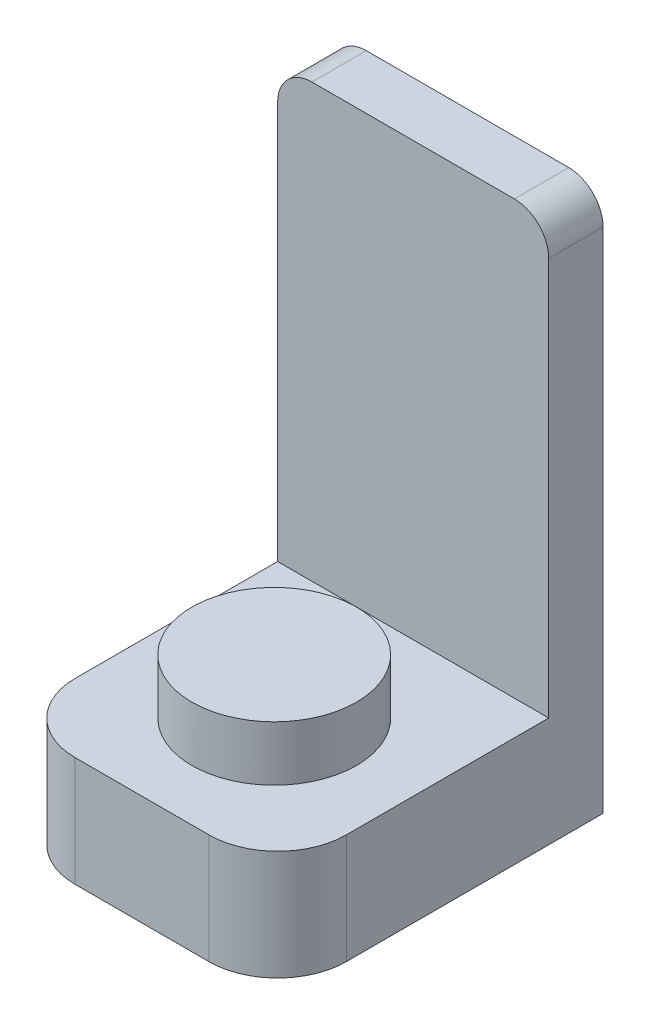
ISO-10303-21;
HEADER;
FILE_DESCRIPTION(('STEP AP214'),'2;1');
FILE_NAME('part.step','',(''),(''),'','','');
FILE_SCHEMA(('AUTOMOTIVE_DESIGN { 1 0 10303 214 1 1 1 1 }'));
ENDSEC;
DATA;
#1=APPLICATION_CONTEXT('core data for automotive mechanical design processes');
#2=APPLICATION_PROTOCOL_DEFINITION('international standard','automotive_design',2000,#1);
#3=PRODUCT_CONTEXT('',#1,'mechanical');
#4=PRODUCT('Part','Part','',(#3));
#5=PRODUCT_RELATED_PRODUCT_CATEGORY('part','',(#4));
#6=PRODUCT_DEFINITION_FORMATION('','',#4);
#7=PRODUCT_DEFINITION_CONTEXT('part definition',#1,'design');
#8=PRODUCT_DEFINITION('design','',#6,#7);
#9=PRODUCT_DEFINITION_SHAPE('','',#8);
#10=(LENGTH_UNIT() NAMED_UNIT(*) SI_UNIT(.MILLI.,.METRE.));
#11=(NAMED_UNIT(*) PLANE_ANGLE_UNIT() SI_UNIT($,.RADIAN.));
#12=(NAMED_UNIT(*) SI_UNIT($,.STERADIAN.) SOLID_ANGLE_UNIT());
#13=UNCERTAINTY_MEASURE_WITH_UNIT(LENGTH_MEASURE(1.E-05),#10,'distance_accuracy_value','');
#14=(GEOMETRIC_REPRESENTATION_CONTEXT(3) GLOBAL_UNCERTAINTY_ASSIGNED_CONTEXT((#13)) GLOBAL_UNIT_ASSIGNED_CONTEXT((#10,
#11,#12)) REPRESENTATION_CONTEXT('',''));
#15=CARTESIAN_POINT('',(0.,0.,0.));
#16=DIRECTION('',(0.,0.,1.));
#17=DIRECTION('',(1.,0.,0.));
#18=AXIS2_PLACEMENT_3D('',#15,#16,#17);
#19=CARTESIAN_POINT('',(0.68196721311474,7.9,-1.58374582752892));
#20=DIRECTION('',(0.,0.,-1.));
#21=DIRECTION('',(0.,1.,0.));
#22=AXIS2_PLACEMENT_3D('',#19,#20,#21);
#23=PLANE('',#22);
#24=CARTESIAN_POINT('',(4.58196721311474,11.95,-1.58374582752892));
#25=DIRECTION('',(0.,0.,-1.));
#26=DIRECTION('',(0.,1.,0.));
#27=AXIS2_PLACEMENT_3D('',#24,#25,#26);
#28=CIRCLE('',#27,2.);
#29=CARTESIAN_POINT('',(4.58196721311474,13.95,-1.58374582752892));
#30=VERTEX_POINT('',#29);
#31=EDGE_CURVE('E223',#30,#30,#28,.F.);
#32=ORIENTED_EDGE('',*,*,#31,.F.);
#33=EDGE_LOOP('',(#32));
#34=FACE_BOUND('',#33,.T.);
#35=ADVANCED_FACE('F41',(#34),#23,.T.);
#36=CARTESIAN_POINT('',(4.58196721311474,11.95,-2.88374582752892));
#37=DIRECTION('',(0.,0.,1.));
#38=DIRECTION('',(0.,-1.,0.));
#39=AXIS2_PLACEMENT_3D('',#36,#37,#38);
#40=PLANE('',#39);
#41=CARTESIAN_POINT('',(4.58196721311474,11.95,-2.88374582752892));
#42=DIRECTION('',(0.,0.,-1.));
#43=DIRECTION('',(0.,-1.,0.));
#44=AXIS2_PLACEMENT_3D('',#41,#42,#43);
#45=CIRCLE('',#44,2.25);
#46=CARTESIAN_POINT('',(4.58196721311474,9.7,-2.88374582752892));
#47=VERTEX_POINT('',#46);
#48=EDGE_CURVE('E237',#47,#47,#45,.T.);
#49=ORIENTED_EDGE('',*,*,#48,.T.);
#50=EDGE_LOOP('',(#49));
#51=FACE_BOUND('',#50,.T.);
#52=CARTESIAN_POINT('',(4.58196721311474,11.95,-2.88374582752892));
#53=DIRECTION('',(0.,0.,-1.));
#54=DIRECTION('',(0.,-1.,0.));
#55=AXIS2_PLACEMENT_3D('',#52,#53,#54);
#56=CIRCLE('',#55,2.);
#57=CARTESIAN_POINT('',(4.58196721311474,9.95,-2.88374582752892));
#58=VERTEX_POINT('',#57);
#59=EDGE_CURVE('E231',#58,#58,#56,.T.);
#60=ORIENTED_EDGE('',*,*,#59,.F.);
#61=EDGE_LOOP('',(#60));
#62=FACE_BOUND('',#61,.T.);
#63=ADVANCED_FACE('F334',(#51,#62),#40,.F.);
#64=CARTESIAN_POINT('',(4.58196721311474,11.95,-2.88374582752892));
#65=DIRECTION('',(0.,0.,1.));
#66=DIRECTION('',(0.,-1.,0.));
#67=AXIS2_PLACEMENT_3D('',#64,#65,#66);
#68=CYLINDRICAL_SURFACE('',#67,2.25);
#69=CARTESIAN_POINT('',(4.58196721311474,11.95,-1.58374582752892));
#70=DIRECTION('',(0.,0.,-1.));
#71=DIRECTION('',(0.,1.,0.));
#72=AXIS2_PLACEMENT_3D('',#69,#70,#71);
#73=CIRCLE('',#72,2.25);
#74=CARTESIAN_POINT('',(4.58196721311474,14.2,-1.58374582752892));
#75=VERTEX_POINT('',#74);
#76=EDGE_CURVE('E234',#75,#75,#73,.F.);
#77=ORIENTED_EDGE('',*,*,#76,.F.);
#78=EDGE_LOOP('',(#77));
#79=FACE_BOUND('',#78,.T.);
#80=ORIENTED_EDGE('',*,*,#48,.F.);
#81=EDGE_LOOP('',(#80));
#82=FACE_BOUND('',#81,.T.);
#83=ADVANCED_FACE('F340',(#79,#82),#68,.T.);
#84=CARTESIAN_POINT('',(4.58196721311474,11.95,-2.88374582752892));
#85=DIRECTION('',(0.,0.,1.));
#86=DIRECTION('',(0.,-1.,0.));
#87=AXIS2_PLACEMENT_3D('',#84,#85,#86);
#88=CYLINDRICAL_SURFACE('',#87,2.);
#89=ORIENTED_EDGE('',*,*,#31,.T.);
#90=EDGE_LOOP('',(#89));
#91=FACE_BOUND('',#90,.T.);
#92=ORIENTED_EDGE('',*,*,#59,.T.);
#93=EDGE_LOOP('',(#92));
#94=FACE_BOUND('',#93,.T.);
#95=ADVANCED_FACE('F455',(#91,#94),#88,.F.);
#96=CARTESIAN_POINT('',(0.,15.4931550495251,-0.383745827528922));
#97=DIRECTION('',(0.,0.,1.));
#98=DIRECTION('',(1.,0.,0.));
#99=AXIS2_PLACEMENT_3D('',#96,#97,#98);
#100=PLANE('',#99);
#101=DIRECTION('',(-1.,0.,0.));
#102=VECTOR('',#101,1.);
#103=CARTESIAN_POINT('',(0.,0.,-0.383745827528922));
#104=LINE('',#103,#102);
#105=CARTESIAN_POINT('',(7.37603841464095,0.,-0.38374582752892));
#106=VERTEX_POINT('',#105);
#107=CARTESIAN_POINT('',(1.88196721311474,0.,-0.383745827528922));
#108=VERTEX_POINT('',#107);
#109=EDGE_CURVE('E395',#106,#108,#104,.T.);
#110=ORIENTED_EDGE('',*,*,#109,.F.);
#111=DIRECTION('',(0.,1.,0.));
#112=VECTOR('',#111,1.);
#113=CARTESIAN_POINT('',(7.37603841464095,0.,-0.38374582752892));
#114=LINE('',#113,#112);
#115=CARTESIAN_POINT('',(7.37603841464095,2.,-0.38374582752892));
#116=VERTEX_POINT('',#115);
#117=EDGE_CURVE('E171',#106,#116,#114,.T.);
#118=ORIENTED_EDGE('',*,*,#117,.T.);
#119=DIRECTION('',(1.,0.,0.));
#120=VECTOR('',#119,1.);
#121=CARTESIAN_POINT('',(0.,2.,-0.383745827528922));
#122=LINE('',#121,#120);
#123=CARTESIAN_POINT('',(5.08017885046247,2.,-0.383745827528922));
#124=VERTEX_POINT('',#123);
#125=EDGE_CURVE('E398',#124,#116,#122,.T.);
#126=ORIENTED_EDGE('',*,*,#125,.F.);
#127=DIRECTION('',(0.,1.,0.));
#128=VECTOR('',#127,1.);
#129=CARTESIAN_POINT('',(5.08017885046247,0.6,-0.383745827528922));
#130=LINE('',#129,#128);
#131=CARTESIAN_POINT('',(5.08017885046247,0.6,-0.383745827528922));
#132=VERTEX_POINT('',#131);
#133=EDGE_CURVE('E372',#132,#124,#130,.T.);
#134=ORIENTED_EDGE('',*,*,#133,.F.);
#135=DIRECTION('',(1.,0.,0.));
#136=VECTOR('',#135,1.);
#137=CARTESIAN_POINT('',(4.08335075213692,0.6,-0.383745827528922));
#138=LINE('',#137,#136);
#139=CARTESIAN_POINT('',(4.08335075213692,0.6,-0.383745827528922));
#140=VERTEX_POINT('',#139);
#141=EDGE_CURVE('E384',#140,#132,#138,.T.);
#142=ORIENTED_EDGE('',*,*,#141,.F.);
#143=DIRECTION('',(0.,1.,0.));
#144=VECTOR('',#143,1.);
#145=CARTESIAN_POINT('',(4.08335075213692,0.6,-0.383745827528922));
#146=LINE('',#145,#144);
#147=CARTESIAN_POINT('',(4.08335075213692,2.,-0.383745827528922));
#148=VERTEX_POINT('',#147);
#149=EDGE_CURVE('E227',#140,#148,#146,.T.);
#150=ORIENTED_EDGE('',*,*,#149,.T.);
#151=CARTESIAN_POINT('',(1.88196721311474,2.,-0.383745827528922));
#152=VERTEX_POINT('',#151);
#153=EDGE_CURVE('E289',#152,#148,#122,.T.);
#154=ORIENTED_EDGE('',*,*,#153,.F.);
#155=DIRECTION('',(0.,-1.,0.));
#156=VECTOR('',#155,1.);
#157=CARTESIAN_POINT('',(1.88196721311474,15.4931550495251,-0.383745827528922));
#158=LINE('',#157,#156);
#159=EDGE_CURVE('E399',#152,#108,#158,.T.);
#160=ORIENTED_EDGE('',*,*,#159,.T.);
#161=EDGE_LOOP('',(#110,#118,#126,#134,#142,#150,#154,#160));
#162=FACE_BOUND('',#161,.T.);
#163=ADVANCED_FACE('F410',(#162),#100,.T.);
#164=CARTESIAN_POINT('',(0.681967213114738,2.,7.9));
#165=DIRECTION('',(0.,-1.,0.));
#166=DIRECTION('',(1.,0.,0.));
#167=AXIS2_PLACEMENT_3D('',#164,#165,#166);
#168=PLANE('',#167);
#169=DIRECTION('',(0.,0.,-1.));
#170=VECTOR('',#169,1.);
#171=CARTESIAN_POINT('',(7.37603841464095,2.,6.7));
#172=LINE('',#171,#170);
#173=CARTESIAN_POINT('',(7.37603841464095,2.,6.7));
#174=VERTEX_POINT('',#173);
#175=EDGE_CURVE('E185',#174,#116,#172,.T.);
#176=ORIENTED_EDGE('',*,*,#175,.F.);
#177=DIRECTION('',(-1.,0.,0.));
#178=VECTOR('',#177,1.);
#179=CARTESIAN_POINT('',(0.,2.,6.7));
#180=LINE('',#179,#178);
#181=CARTESIAN_POINT('',(1.88196721311474,2.,6.7));
#182=VERTEX_POINT('',#181);
#183=EDGE_CURVE('E184',#174,#182,#180,.T.);
#184=ORIENTED_EDGE('',*,*,#183,.T.);
#185=DIRECTION('',(0.,0.,-1.));
#186=VECTOR('',#185,1.);
#187=CARTESIAN_POINT('',(1.88196721311474,2.,7.9));
#188=LINE('',#187,#186);
#189=EDGE_CURVE('E193',#182,#152,#188,.T.);
#190=ORIENTED_EDGE('',*,*,#189,.T.);
#191=ORIENTED_EDGE('',*,*,#153,.T.);
#192=DIRECTION('',(0.,0.,1.));
#193=VECTOR('',#192,1.);
#194=CARTESIAN_POINT('',(4.08335075213692,2.,7.9));
#195=LINE('',#194,#193);
#196=CARTESIAN_POINT('',(4.08335075213692,2.,0.616254172471078));
#197=VERTEX_POINT('',#196);
#198=EDGE_CURVE('E392',#148,#197,#195,.T.);
#199=ORIENTED_EDGE('',*,*,#198,.T.);
#200=DIRECTION('',(1.,0.,0.));
#201=VECTOR('',#200,1.);
#202=CARTESIAN_POINT('',(0.681967213114738,2.,0.616254172471078));
#203=LINE('',#202,#201);
#204=CARTESIAN_POINT('',(5.08017885046247,2.,0.616254172471078));
#205=VERTEX_POINT('',#204);
#206=EDGE_CURVE('E217',#197,#205,#203,.T.);
#207=ORIENTED_EDGE('',*,*,#206,.T.);
#208=DIRECTION('',(0.,0.,-1.));
#209=VECTOR('',#208,1.);
#210=CARTESIAN_POINT('',(5.08017885046247,2.,7.9));
#211=LINE('',#210,#209);
#212=EDGE_CURVE('E389',#205,#124,#211,.T.);
#213=ORIENTED_EDGE('',*,*,#212,.T.);
#214=ORIENTED_EDGE('',*,*,#125,.T.);
#215=EDGE_LOOP('',(#176,#184,#190,#191,#199,#207,#213,#214));
#216=FACE_BOUND('',#215,.T.);
#217=CARTESIAN_POINT('',(4.58196721311474,2.,4.));
#218=DIRECTION('',(0.,-1.,0.));
#219=DIRECTION('',(1.,0.,0.));
#220=AXIS2_PLACEMENT_3D('',#217,#218,#219);
#221=CIRCLE('',#220,1.2);
#222=CARTESIAN_POINT('',(5.78196721311474,2.,4.));
#223=VERTEX_POINT('',#222);
#224=EDGE_CURVE('E204',#223,#223,#221,.F.);
#225=ORIENTED_EDGE('',*,*,#224,.T.);
#226=EDGE_LOOP('',(#225));
#227=FACE_BOUND('',#226,.T.);
#228=ADVANCED_FACE('F407',(#216,#227),#168,.T.);
#229=CARTESIAN_POINT('',(0.681967213114738,0.,7.9));
#230=DIRECTION('',(0.,1.,0.));
#231=DIRECTION('',(0.,0.,1.));
#232=AXIS2_PLACEMENT_3D('',#229,#230,#231);
#233=PLANE('',#232);
#234=DIRECTION('',(0.,0.,-1.));
#235=VECTOR('',#234,1.);
#236=CARTESIAN_POINT('',(7.37603841464095,0.,6.7));
#237=LINE('',#236,#235);
#238=CARTESIAN_POINT('',(7.37603841464095,0.,6.7));
#239=VERTEX_POINT('',#238);
#240=EDGE_CURVE('E165',#239,#106,#237,.T.);
#241=ORIENTED_EDGE('',*,*,#240,.T.);
#242=ORIENTED_EDGE('',*,*,#109,.T.);
#243=DIRECTION('',(0.,0.,-1.));
#244=VECTOR('',#243,1.);
#245=CARTESIAN_POINT('',(1.88196721311474,0.,7.9));
#246=LINE('',#245,#244);
#247=CARTESIAN_POINT('',(1.88196721311474,0.,6.7));
#248=VERTEX_POINT('',#247);
#249=EDGE_CURVE('E190',#248,#108,#246,.T.);
#250=ORIENTED_EDGE('',*,*,#249,.F.);
#251=DIRECTION('',(1.,0.,0.));
#252=VECTOR('',#251,1.);
#253=CARTESIAN_POINT('',(0.,0.,6.7));
#254=LINE('',#253,#252);
#255=EDGE_CURVE('E182',#248,#239,#254,.T.);
#256=ORIENTED_EDGE('',*,*,#255,.T.);
#257=EDGE_LOOP('',(#241,#242,#250,#256));
#258=FACE_BOUND('',#257,.T.);
#259=DIRECTION('',(1.,0.,0.));
#260=VECTOR('',#259,1.);
#261=CARTESIAN_POINT('',(0.681967213114738,0.,7.9));
#262=LINE('',#261,#260);
#263=CARTESIAN_POINT('',(2.68196721311474,0.,7.9));
#264=VERTEX_POINT('',#263);
#265=CARTESIAN_POINT('',(6.58196721311474,0.,7.9));
#266=VERTEX_POINT('',#265);
#267=EDGE_CURVE('E203',#264,#266,#262,.T.);
#268=ORIENTED_EDGE('',*,*,#267,.F.);
#269=CARTESIAN_POINT('',(2.68196721311474,0.,5.9));
#270=DIRECTION('',(0.,1.,0.));
#271=DIRECTION('',(0.,0.,1.));
#272=AXIS2_PLACEMENT_3D('',#269,#270,#271);
#273=CIRCLE('',#272,2.);
#274=CARTESIAN_POINT('',(0.681967213114738,0.,5.9));
#275=VERTEX_POINT('',#274);
#276=EDGE_CURVE('E266',#264,#275,#273,.F.);
#277=ORIENTED_EDGE('',*,*,#276,.T.);
#278=DIRECTION('',(0.,0.,-1.));
#279=VECTOR('',#278,1.);
#280=CARTESIAN_POINT('',(0.681967213114738,0.,7.9));
#281=LINE('',#280,#279);
#282=CARTESIAN_POINT('',(0.68196721311474,0.,-1.58374582752892));
#283=VERTEX_POINT('',#282);
#284=EDGE_CURVE('E212',#275,#283,#281,.T.);
#285=ORIENTED_EDGE('',*,*,#284,.T.);
#286=DIRECTION('',(1.,0.,0.));
#287=VECTOR('',#286,1.);
#288=CARTESIAN_POINT('',(0.68196721311474,0.,-1.58374582752892));
#289=LINE('',#288,#287);
#290=CARTESIAN_POINT('',(8.58196721311474,0.,-1.58374582752892));
#291=VERTEX_POINT('',#290);
#292=EDGE_CURVE('E291',#283,#291,#289,.T.);
#293=ORIENTED_EDGE('',*,*,#292,.T.);
#294=DIRECTION('',(0.,0.,1.));
#295=VECTOR('',#294,1.);
#296=CARTESIAN_POINT('',(8.58196721311474,0.,7.9));
#297=LINE('',#296,#295);
#298=CARTESIAN_POINT('',(8.58196721311474,0.,5.9));
#299=VERTEX_POINT('',#298);
#300=EDGE_CURVE('E412',#291,#299,#297,.T.);
#301=ORIENTED_EDGE('',*,*,#300,.T.);
#302=CARTESIAN_POINT('',(6.58196721311474,0.,5.9));
#303=DIRECTION('',(0.,1.,0.));
#304=DIRECTION('',(0.,0.,1.));
#305=AXIS2_PLACEMENT_3D('',#302,#303,#304);
#306=CIRCLE('',#305,2.);
#307=EDGE_CURVE('E264',#299,#266,#306,.F.);
#308=ORIENTED_EDGE('',*,*,#307,.T.);
#309=EDGE_LOOP('',(#268,#277,#285,#293,#301,#308));
#310=FACE_BOUND('',#309,.T.);
#311=ADVANCED_FACE('F187',(#258,#310),#233,.F.);
#312=CARTESIAN_POINT('',(0.681967213114738,3.2,7.9));
#313=DIRECTION('',(0.,-1.,0.));
#314=DIRECTION('',(1.,0.,0.));
#315=AXIS2_PLACEMENT_3D('',#312,#313,#314);
#316=PLANE('',#315);
#317=CARTESIAN_POINT('',(4.58196721311474,3.2,4.));
#318=DIRECTION('',(0.,-1.,0.));
#319=DIRECTION('',(1.,0.,0.));
#320=AXIS2_PLACEMENT_3D('',#317,#318,#319);
#321=CIRCLE('',#320,2.4);
#322=CARTESIAN_POINT('',(6.98196721311474,3.2,4.));
#323=VERTEX_POINT('',#322);
#324=EDGE_CURVE('E214',#323,#323,#321,.F.);
#325=ORIENTED_EDGE('',*,*,#324,.F.);
#326=EDGE_LOOP('',(#325));
#327=FACE_BOUND('',#326,.T.);
#328=DIRECTION('',(0.,0.,-1.));
#329=VECTOR('',#328,1.);
#330=CARTESIAN_POINT('',(0.681967213114738,3.2,7.9));
#331=LINE('',#330,#329);
#332=CARTESIAN_POINT('',(0.681967213114738,3.2,5.9));
#333=VERTEX_POINT('',#332);
#334=CARTESIAN_POINT('',(0.681967213114738,3.2,0.));
#335=VERTEX_POINT('',#334);
#336=EDGE_CURVE('E210',#333,#335,#331,.T.);
#337=ORIENTED_EDGE('',*,*,#336,.F.);
#338=CARTESIAN_POINT('',(2.68196721311474,3.2,5.9));
#339=DIRECTION('',(0.,-1.,0.));
#340=DIRECTION('',(1.,0.,0.));
#341=AXIS2_PLACEMENT_3D('',#338,#339,#340);
#342=CIRCLE('',#341,2.);
#343=CARTESIAN_POINT('',(2.68196721311474,3.2,7.9));
#344=VERTEX_POINT('',#343);
#345=EDGE_CURVE('E49',#333,#344,#342,.F.);
#346=ORIENTED_EDGE('',*,*,#345,.T.);
#347=DIRECTION('',(-1.,0.,0.));
#348=VECTOR('',#347,1.);
#349=CARTESIAN_POINT('',(0.681967213114738,3.2,7.9));
#350=LINE('',#349,#348);
#351=CARTESIAN_POINT('',(6.58196721311474,3.2,7.9));
#352=VERTEX_POINT('',#351);
#353=EDGE_CURVE('E207',#352,#344,#350,.T.);
#354=ORIENTED_EDGE('',*,*,#353,.F.);
#355=CARTESIAN_POINT('',(6.58196721311474,3.2,5.9));
#356=DIRECTION('',(0.,-1.,0.));
#357=DIRECTION('',(1.,0.,0.));
#358=AXIS2_PLACEMENT_3D('',#355,#356,#357);
#359=CIRCLE('',#358,2.);
#360=CARTESIAN_POINT('',(8.58196721311474,3.2,5.9));
#361=VERTEX_POINT('',#360);
#362=EDGE_CURVE('E56',#352,#361,#359,.F.);
#363=ORIENTED_EDGE('',*,*,#362,.T.);
#364=DIRECTION('',(0.,0.,-1.));
#365=VECTOR('',#364,1.);
#366=CARTESIAN_POINT('',(8.58196721311474,3.2,6.4));
#367=LINE('',#366,#365);
#368=CARTESIAN_POINT('',(8.58196721311474,3.2,0.));
#369=VERTEX_POINT('',#368);
#370=EDGE_CURVE('E414',#361,#369,#367,.T.);
#371=ORIENTED_EDGE('',*,*,#370,.T.);
#372=DIRECTION('',(1.,0.,0.));
#373=VECTOR('',#372,1.);
#374=CARTESIAN_POINT('',(0.681967213114738,3.2,0.));
#375=LINE('',#374,#373);
#376=EDGE_CURVE('E299',#335,#369,#375,.T.);
#377=ORIENTED_EDGE('',*,*,#376,.F.);
#378=EDGE_LOOP('',(#337,#346,#354,#363,#371,#377));
#379=FACE_BOUND('',#378,.T.);
#380=ADVANCED_FACE('F270',(#327,#379),#316,.F.);
#381=CARTESIAN_POINT('',(0.681967213114738,0.,7.9));
#382=DIRECTION('',(1.,0.,0.));
#383=DIRECTION('',(0.,0.,-1.));
#384=AXIS2_PLACEMENT_3D('',#381,#382,#383);
#385=PLANE('',#384);
#386=ORIENTED_EDGE('',*,*,#284,.F.);
#387=DIRECTION('',(0.,-1.,0.));
#388=VECTOR('',#387,1.);
#389=CARTESIAN_POINT('',(0.681967213114738,0.,5.9));
#390=LINE('',#389,#388);
#391=EDGE_CURVE('E64',#275,#333,#390,.F.);
#392=ORIENTED_EDGE('',*,*,#391,.T.);
#393=ORIENTED_EDGE('',*,*,#336,.T.);
#394=DIRECTION('',(0.,-1.,0.));
#395=VECTOR('',#394,1.);
#396=CARTESIAN_POINT('',(0.68196721311474,0.,0.));
#397=LINE('',#396,#395);
#398=CARTESIAN_POINT('',(0.68196721311474,14.8,0.));
#399=VERTEX_POINT('',#398);
#400=EDGE_CURVE('E288',#399,#335,#397,.T.);
#401=ORIENTED_EDGE('',*,*,#400,.F.);
#402=DIRECTION('',(0.,0.,-1.));
#403=VECTOR('',#402,1.);
#404=CARTESIAN_POINT('',(0.681967213114738,14.8,7.9));
#405=LINE('',#404,#403);
#406=CARTESIAN_POINT('',(0.68196721311474,14.8,-1.58374582752892));
#407=VERTEX_POINT('',#406);
#408=EDGE_CURVE('E255',#399,#407,#405,.T.);
#409=ORIENTED_EDGE('',*,*,#408,.T.);
#410=DIRECTION('',(0.,1.,0.));
#411=VECTOR('',#410,1.);
#412=CARTESIAN_POINT('',(0.68196721311474,7.9,-1.58374582752892));
#413=LINE('',#412,#411);
#414=EDGE_CURVE('E283',#283,#407,#413,.T.);
#415=ORIENTED_EDGE('',*,*,#414,.F.);
#416=EDGE_LOOP('',(#386,#392,#393,#401,#409,#415));
#417=FACE_BOUND('',#416,.T.);
#418=ADVANCED_FACE('F281',(#417),#385,.F.);
#419=CARTESIAN_POINT('',(0.,0.,7.9));
#420=DIRECTION('',(0.,0.,-1.));
#421=DIRECTION('',(-1.,0.,0.));
#422=AXIS2_PLACEMENT_3D('',#419,#420,#421);
#423=PLANE('',#422);
#424=ORIENTED_EDGE('',*,*,#353,.T.);
#425=DIRECTION('',(0.,-1.,0.));
#426=VECTOR('',#425,1.);
#427=CARTESIAN_POINT('',(2.68196721311474,0.,7.9));
#428=LINE('',#427,#426);
#429=EDGE_CURVE('E261',#344,#264,#428,.T.);
#430=ORIENTED_EDGE('',*,*,#429,.T.);
#431=ORIENTED_EDGE('',*,*,#267,.T.);
#432=DIRECTION('',(0.,1.,0.));
#433=VECTOR('',#432,1.);
#434=CARTESIAN_POINT('',(6.58196721311474,0.,7.9));
#435=LINE('',#434,#433);
#436=EDGE_CURVE('E258',#266,#352,#435,.T.);
#437=ORIENTED_EDGE('',*,*,#436,.T.);
#438=EDGE_LOOP('',(#424,#430,#431,#437));
#439=FACE_BOUND('',#438,.T.);
#440=ADVANCED_FACE('F275',(#439),#423,.F.);
#441=CARTESIAN_POINT('',(4.58196721311474,4.8,4.));
#442=DIRECTION('',(0.,-1.,0.));
#443=DIRECTION('',(0.,0.,-1.));
#444=AXIS2_PLACEMENT_3D('',#441,#442,#443);
#445=CYLINDRICAL_SURFACE('',#444,2.4);
#446=CARTESIAN_POINT('',(4.58196721311474,4.8,4.));
#447=DIRECTION('',(0.,1.,0.));
#448=DIRECTION('',(0.,0.,1.));
#449=AXIS2_PLACEMENT_3D('',#446,#447,#448);
#450=CIRCLE('',#449,2.4);
#451=CARTESIAN_POINT('',(4.58196721311474,4.8,6.4));
#452=VERTEX_POINT('',#451);
#453=EDGE_CURVE('E200',#452,#452,#450,.T.);
#454=ORIENTED_EDGE('',*,*,#453,.F.);
#455=EDGE_LOOP('',(#454));
#456=FACE_BOUND('',#455,.T.);
#457=ORIENTED_EDGE('',*,*,#324,.T.);
#458=EDGE_LOOP('',(#457));
#459=FACE_BOUND('',#458,.T.);
#460=ADVANCED_FACE('F469',(#456,#459),#445,.T.);
#461=CARTESIAN_POINT('',(4.58196721311474,4.8,4.));
#462=DIRECTION('',(0.,1.,0.));
#463=DIRECTION('',(0.,0.,1.));
#464=AXIS2_PLACEMENT_3D('',#461,#462,#463);
#465=PLANE('',#464);
#466=ORIENTED_EDGE('',*,*,#453,.T.);
#467=EDGE_LOOP('',(#466));
#468=FACE_BOUND('',#467,.T.);
#469=ADVANCED_FACE('F471',(#468),#465,.T.);
#470=CARTESIAN_POINT('',(1.88196721311474,0.,7.9));
#471=DIRECTION('',(1.,0.,0.));
#472=DIRECTION('',(0.,0.,-1.));
#473=AXIS2_PLACEMENT_3D('',#470,#471,#472);
#474=PLANE('',#473);
#475=ORIENTED_EDGE('',*,*,#249,.T.);
#476=ORIENTED_EDGE('',*,*,#159,.F.);
#477=ORIENTED_EDGE('',*,*,#189,.F.);
#478=DIRECTION('',(0.,-1.,0.));
#479=VECTOR('',#478,1.);
#480=CARTESIAN_POINT('',(1.88196721311474,0.,6.7));
#481=LINE('',#480,#479);
#482=EDGE_CURVE('E191',#182,#248,#481,.T.);
#483=ORIENTED_EDGE('',*,*,#482,.T.);
#484=EDGE_LOOP('',(#475,#476,#477,#483));
#485=FACE_BOUND('',#484,.T.);
#486=ADVANCED_FACE('F474',(#485),#474,.T.);
#487=CARTESIAN_POINT('',(0.,0.,6.7));
#488=DIRECTION('',(0.,0.,-1.));
#489=DIRECTION('',(-1.,0.,0.));
#490=AXIS2_PLACEMENT_3D('',#487,#488,#489);
#491=PLANE('',#490);
#492=DIRECTION('',(0.,1.,0.));
#493=VECTOR('',#492,1.);
#494=CARTESIAN_POINT('',(7.37603841464095,0.,6.7));
#495=LINE('',#494,#493);
#496=EDGE_CURVE('E168',#239,#174,#495,.T.);
#497=ORIENTED_EDGE('',*,*,#496,.F.);
#498=ORIENTED_EDGE('',*,*,#255,.F.);
#499=ORIENTED_EDGE('',*,*,#482,.F.);
#500=ORIENTED_EDGE('',*,*,#183,.F.);
#501=EDGE_LOOP('',(#497,#498,#499,#500));
#502=FACE_BOUND('',#501,.T.);
#503=ADVANCED_FACE('F180',(#502),#491,.T.);
#504=CARTESIAN_POINT('',(4.58196721311474,4.8,4.));
#505=DIRECTION('',(0.,-1.,0.));
#506=DIRECTION('',(0.,0.,-1.));
#507=AXIS2_PLACEMENT_3D('',#504,#505,#506);
#508=CYLINDRICAL_SURFACE('',#507,1.2);
#509=CARTESIAN_POINT('',(4.58196721311474,3.6,4.));
#510=DIRECTION('',(0.,1.,0.));
#511=DIRECTION('',(0.,0.,1.));
#512=AXIS2_PLACEMENT_3D('',#509,#510,#511);
#513=CIRCLE('',#512,1.2);
#514=CARTESIAN_POINT('',(4.58196721311474,3.6,5.2));
#515=VERTEX_POINT('',#514);
#516=EDGE_CURVE('E195',#515,#515,#513,.T.);
#517=ORIENTED_EDGE('',*,*,#516,.T.);
#518=EDGE_LOOP('',(#517));
#519=FACE_BOUND('',#518,.T.);
#520=ORIENTED_EDGE('',*,*,#224,.F.);
#521=EDGE_LOOP('',(#520));
#522=FACE_BOUND('',#521,.T.);
#523=ADVANCED_FACE('F312',(#519,#522),#508,.F.);
#524=CARTESIAN_POINT('',(4.58196721311474,3.6,4.));
#525=DIRECTION('',(0.,1.,0.));
#526=DIRECTION('',(0.,0.,1.));
#527=AXIS2_PLACEMENT_3D('',#524,#525,#526);
#528=PLANE('',#527);
#529=ORIENTED_EDGE('',*,*,#516,.F.);
#530=EDGE_LOOP('',(#529));
#531=FACE_BOUND('',#530,.T.);
#532=ADVANCED_FACE('F315',(#531),#528,.F.);
#533=ORIENTED_EDGE('',*,*,#76,.T.);
#534=EDGE_LOOP('',(#533));
#535=FACE_BOUND('',#534,.T.);
#536=DIRECTION('',(1.,0.,0.));
#537=VECTOR('',#536,1.);
#538=CARTESIAN_POINT('',(0.681967213114738,15.8,-1.58374582752892));
#539=LINE('',#538,#537);
#540=CARTESIAN_POINT('',(1.68196721311474,15.8,-1.58374582752892));
#541=VERTEX_POINT('',#540);
#542=CARTESIAN_POINT('',(7.58196721311474,15.8,-1.58374582752892));
#543=VERTEX_POINT('',#542);
#544=EDGE_CURVE('E175',#541,#543,#539,.T.);
#545=ORIENTED_EDGE('',*,*,#544,.T.);
#546=CARTESIAN_POINT('',(7.58196721311474,14.8,-1.58374582752892));
#547=DIRECTION('',(0.,0.,-1.));
#548=DIRECTION('',(0.,1.,0.));
#549=AXIS2_PLACEMENT_3D('',#546,#547,#548);
#550=CIRCLE('',#549,1.);
#551=CARTESIAN_POINT('',(8.58196721311474,14.8,-1.58374582752892));
#552=VERTEX_POINT('',#551);
#553=EDGE_CURVE('E247',#543,#552,#550,.T.);
#554=ORIENTED_EDGE('',*,*,#553,.T.);
#555=DIRECTION('',(0.,-1.,0.));
#556=VECTOR('',#555,1.);
#557=CARTESIAN_POINT('',(8.58196721311474,6.2,-1.58374582752892));
#558=LINE('',#557,#556);
#559=EDGE_CURVE('E296',#552,#291,#558,.T.);
#560=ORIENTED_EDGE('',*,*,#559,.T.);
#561=ORIENTED_EDGE('',*,*,#292,.F.);
#562=ORIENTED_EDGE('',*,*,#414,.T.);
#563=CARTESIAN_POINT('',(1.68196721311474,14.8,-1.58374582752892));
#564=DIRECTION('',(0.,0.,-1.));
#565=DIRECTION('',(0.,1.,0.));
#566=AXIS2_PLACEMENT_3D('',#563,#564,#565);
#567=CIRCLE('',#566,1.);
#568=EDGE_CURVE('E245',#407,#541,#567,.T.);
#569=ORIENTED_EDGE('',*,*,#568,.T.);
#570=EDGE_LOOP('',(#545,#554,#560,#561,#562,#569));
#571=FACE_BOUND('',#570,.T.);
#572=CARTESIAN_POINT('',(4.58196721311474,3.95,-1.58374582752892));
#573=DIRECTION('',(0.,0.,-1.));
#574=DIRECTION('',(0.,1.,0.));
#575=AXIS2_PLACEMENT_3D('',#572,#573,#574);
#576=CIRCLE('',#575,2.25);
#577=CARTESIAN_POINT('',(4.58196721311474,6.2,-1.58374582752892));
#578=VERTEX_POINT('',#577);
#579=EDGE_CURVE('E224',#578,#578,#576,.F.);
#580=ORIENTED_EDGE('',*,*,#579,.T.);
#581=EDGE_LOOP('',(#580));
#582=FACE_BOUND('',#581,.T.);
#583=ADVANCED_FACE('F293',(#535,#571,#582),#23,.T.);
#584=CARTESIAN_POINT('',(0.68196721311474,0.,0.));
#585=DIRECTION('',(0.,0.,1.));
#586=DIRECTION('',(1.,0.,0.));
#587=AXIS2_PLACEMENT_3D('',#584,#585,#586);
#588=PLANE('',#587);
#589=DIRECTION('',(0.,1.,0.));
#590=VECTOR('',#589,1.);
#591=CARTESIAN_POINT('',(8.58196721311474,7.9,0.));
#592=LINE('',#591,#590);
#593=CARTESIAN_POINT('',(8.58196721311474,14.8,0.));
#594=VERTEX_POINT('',#593);
#595=EDGE_CURVE('E419',#369,#594,#592,.T.);
#596=ORIENTED_EDGE('',*,*,#595,.T.);
#597=CARTESIAN_POINT('',(7.58196721311474,14.8,0.));
#598=DIRECTION('',(0.,0.,1.));
#599=DIRECTION('',(1.,0.,0.));
#600=AXIS2_PLACEMENT_3D('',#597,#598,#599);
#601=CIRCLE('',#600,1.);
#602=CARTESIAN_POINT('',(7.58196721311474,15.8,0.));
#603=VERTEX_POINT('',#602);
#604=EDGE_CURVE('E253',#594,#603,#601,.T.);
#605=ORIENTED_EDGE('',*,*,#604,.T.);
#606=DIRECTION('',(1.,0.,0.));
#607=VECTOR('',#606,1.);
#608=CARTESIAN_POINT('',(0.681967213114738,15.8,0.));
#609=LINE('',#608,#607);
#610=CARTESIAN_POINT('',(1.68196721311474,15.8,0.));
#611=VERTEX_POINT('',#610);
#612=EDGE_CURVE('E433',#611,#603,#609,.T.);
#613=ORIENTED_EDGE('',*,*,#612,.F.);
#614=CARTESIAN_POINT('',(1.68196721311474,14.8,0.));
#615=DIRECTION('',(0.,0.,1.));
#616=DIRECTION('',(1.,0.,0.));
#617=AXIS2_PLACEMENT_3D('',#614,#615,#616);
#618=CIRCLE('',#617,1.);
#619=EDGE_CURVE('E251',#611,#399,#618,.T.);
#620=ORIENTED_EDGE('',*,*,#619,.T.);
#621=ORIENTED_EDGE('',*,*,#400,.T.);
#622=ORIENTED_EDGE('',*,*,#376,.T.);
#623=EDGE_LOOP('',(#596,#605,#613,#620,#621,#622));
#624=FACE_BOUND('',#623,.T.);
#625=ADVANCED_FACE('F318',(#624),#588,.T.);
#626=CARTESIAN_POINT('',(4.08335075213692,0.6,-0.383745827528922));
#627=DIRECTION('',(1.,0.,0.));
#628=DIRECTION('',(0.,1.,0.));
#629=AXIS2_PLACEMENT_3D('',#626,#627,#628);
#630=PLANE('',#629);
#631=ORIENTED_EDGE('',*,*,#198,.F.);
#632=ORIENTED_EDGE('',*,*,#149,.F.);
#633=DIRECTION('',(0.,0.,-1.));
#634=VECTOR('',#633,1.);
#635=CARTESIAN_POINT('',(4.08335075213692,0.6,-0.383745827528922));
#636=LINE('',#635,#634);
#637=CARTESIAN_POINT('',(4.08335075213692,0.6,0.616254172471078));
#638=VERTEX_POINT('',#637);
#639=EDGE_CURVE('E386',#638,#140,#636,.T.);
#640=ORIENTED_EDGE('',*,*,#639,.F.);
#641=DIRECTION('',(0.,1.,0.));
#642=VECTOR('',#641,1.);
#643=CARTESIAN_POINT('',(4.08335075213692,0.6,0.616254172471078));
#644=LINE('',#643,#642);
#645=EDGE_CURVE('E377',#638,#197,#644,.T.);
#646=ORIENTED_EDGE('',*,*,#645,.T.);
#647=EDGE_LOOP('',(#631,#632,#640,#646));
#648=FACE_BOUND('',#647,.T.);
#649=ADVANCED_FACE('F327',(#648),#630,.F.);
#650=CARTESIAN_POINT('',(5.08017885046247,0.6,0.616254172471078));
#651=DIRECTION('',(-1.,0.,0.));
#652=DIRECTION('',(0.,-1.,0.));
#653=AXIS2_PLACEMENT_3D('',#650,#651,#652);
#654=PLANE('',#653);
#655=ORIENTED_EDGE('',*,*,#212,.F.);
#656=DIRECTION('',(0.,1.,0.));
#657=VECTOR('',#656,1.);
#658=CARTESIAN_POINT('',(5.08017885046247,0.6,0.616254172471078));
#659=LINE('',#658,#657);
#660=CARTESIAN_POINT('',(5.08017885046247,0.6,0.616254172471078));
#661=VERTEX_POINT('',#660);
#662=EDGE_CURVE('E374',#661,#205,#659,.T.);
#663=ORIENTED_EDGE('',*,*,#662,.F.);
#664=DIRECTION('',(0.,0.,1.));
#665=VECTOR('',#664,1.);
#666=CARTESIAN_POINT('',(5.08017885046247,0.6,0.616254172471078));
#667=LINE('',#666,#665);
#668=EDGE_CURVE('E382',#132,#661,#667,.T.);
#669=ORIENTED_EDGE('',*,*,#668,.F.);
#670=ORIENTED_EDGE('',*,*,#133,.T.);
#671=EDGE_LOOP('',(#655,#663,#669,#670));
#672=FACE_BOUND('',#671,.T.);
#673=ADVANCED_FACE('F502',(#672),#654,.F.);
#674=CARTESIAN_POINT('',(4.08335075213692,0.6,0.616254172471078));
#675=DIRECTION('',(0.,0.,-1.));
#676=DIRECTION('',(-1.,0.,0.));
#677=AXIS2_PLACEMENT_3D('',#674,#675,#676);
#678=PLANE('',#677);
#679=ORIENTED_EDGE('',*,*,#206,.F.);
#680=ORIENTED_EDGE('',*,*,#645,.F.);
#681=DIRECTION('',(-1.,0.,0.));
#682=VECTOR('',#681,1.);
#683=CARTESIAN_POINT('',(4.08335075213692,0.6,0.616254172471078));
#684=LINE('',#683,#682);
#685=EDGE_CURVE('E380',#661,#638,#684,.T.);
#686=ORIENTED_EDGE('',*,*,#685,.F.);
#687=ORIENTED_EDGE('',*,*,#662,.T.);
#688=EDGE_LOOP('',(#679,#680,#686,#687));
#689=FACE_BOUND('',#688,.T.);
#690=ADVANCED_FACE('F498',(#689),#678,.F.);
#691=CARTESIAN_POINT('',(0.,0.6,0.));
#692=DIRECTION('',(0.,1.,0.));
#693=DIRECTION('',(0.,0.,1.));
#694=AXIS2_PLACEMENT_3D('',#691,#692,#693);
#695=PLANE('',#694);
#696=ORIENTED_EDGE('',*,*,#639,.T.);
#697=ORIENTED_EDGE('',*,*,#141,.T.);
#698=ORIENTED_EDGE('',*,*,#668,.T.);
#699=ORIENTED_EDGE('',*,*,#685,.T.);
#700=EDGE_LOOP('',(#696,#697,#698,#699));
#701=FACE_BOUND('',#700,.T.);
#702=ADVANCED_FACE('F494',(#701),#695,.F.);
#703=CARTESIAN_POINT('',(4.58196721311474,3.95,-2.88374582752892));
#704=DIRECTION('',(0.,0.,1.));
#705=DIRECTION('',(0.,-1.,0.));
#706=AXIS2_PLACEMENT_3D('',#703,#704,#705);
#707=PLANE('',#706);
#708=CARTESIAN_POINT('',(4.58196721311474,3.95,-2.88374582752892));
#709=DIRECTION('',(0.,0.,-1.));
#710=DIRECTION('',(0.,-1.,0.));
#711=AXIS2_PLACEMENT_3D('',#708,#709,#710);
#712=CIRCLE('',#711,2.25);
#713=CARTESIAN_POINT('',(4.58196721311474,1.7,-2.88374582752892));
#714=VERTEX_POINT('',#713);
#715=EDGE_CURVE('E364',#714,#714,#712,.T.);
#716=ORIENTED_EDGE('',*,*,#715,.T.);
#717=EDGE_LOOP('',(#716));
#718=FACE_BOUND('',#717,.T.);
#719=CARTESIAN_POINT('',(4.58196721311474,3.95,-2.88374582752892));
#720=DIRECTION('',(0.,0.,-1.));
#721=DIRECTION('',(0.,-1.,0.));
#722=AXIS2_PLACEMENT_3D('',#719,#720,#721);
#723=CIRCLE('',#722,2.);
#724=CARTESIAN_POINT('',(4.58196721311474,1.95,-2.88374582752892));
#725=VERTEX_POINT('',#724);
#726=EDGE_CURVE('E228',#725,#725,#723,.T.);
#727=ORIENTED_EDGE('',*,*,#726,.F.);
#728=EDGE_LOOP('',(#727));
#729=FACE_BOUND('',#728,.T.);
#730=ADVANCED_FACE('F497',(#718,#729),#707,.F.);
#731=CARTESIAN_POINT('',(4.58196721311474,3.95,-2.88374582752892));
#732=DIRECTION('',(0.,0.,1.));
#733=DIRECTION('',(0.,-1.,0.));
#734=AXIS2_PLACEMENT_3D('',#731,#732,#733);
#735=CYLINDRICAL_SURFACE('',#734,2.25);
#736=ORIENTED_EDGE('',*,*,#579,.F.);
#737=EDGE_LOOP('',(#736));
#738=FACE_BOUND('',#737,.T.);
#739=ORIENTED_EDGE('',*,*,#715,.F.);
#740=EDGE_LOOP('',(#739));
#741=FACE_BOUND('',#740,.T.);
#742=ADVANCED_FACE('F356',(#738,#741),#735,.T.);
#743=CARTESIAN_POINT('',(4.58196721311474,3.95,-2.88374582752892));
#744=DIRECTION('',(0.,0.,1.));
#745=DIRECTION('',(0.,-1.,0.));
#746=AXIS2_PLACEMENT_3D('',#743,#744,#745);
#747=CYLINDRICAL_SURFACE('',#746,2.);
#748=CARTESIAN_POINT('',(4.58196721311474,3.95,-1.58374582752892));
#749=DIRECTION('',(0.,0.,-1.));
#750=DIRECTION('',(0.,1.,0.));
#751=AXIS2_PLACEMENT_3D('',#748,#749,#750);
#752=CIRCLE('',#751,2.);
#753=CARTESIAN_POINT('',(4.58196721311474,5.95,-1.58374582752892));
#754=VERTEX_POINT('',#753);
#755=EDGE_CURVE('E220',#754,#754,#752,.F.);
#756=ORIENTED_EDGE('',*,*,#755,.T.);
#757=EDGE_LOOP('',(#756));
#758=FACE_BOUND('',#757,.T.);
#759=ORIENTED_EDGE('',*,*,#726,.T.);
#760=EDGE_LOOP('',(#759));
#761=FACE_BOUND('',#760,.T.);
#762=ADVANCED_FACE('F347',(#758,#761),#747,.F.);
#763=ORIENTED_EDGE('',*,*,#755,.F.);
#764=EDGE_LOOP('',(#763));
#765=FACE_BOUND('',#764,.T.);
#766=ADVANCED_FACE('F326',(#765),#23,.T.);
#767=CARTESIAN_POINT('',(8.58196721311474,0.,0.));
#768=DIRECTION('',(-1.,0.,0.));
#769=DIRECTION('',(0.,0.,1.));
#770=AXIS2_PLACEMENT_3D('',#767,#768,#769);
#771=PLANE('',#770);
#772=ORIENTED_EDGE('',*,*,#370,.F.);
#773=DIRECTION('',(0.,1.,0.));
#774=VECTOR('',#773,1.);
#775=CARTESIAN_POINT('',(8.58196721311474,0.,5.9));
#776=LINE('',#775,#774);
#777=EDGE_CURVE('E11',#361,#299,#776,.F.);
#778=ORIENTED_EDGE('',*,*,#777,.T.);
#779=ORIENTED_EDGE('',*,*,#300,.F.);
#780=ORIENTED_EDGE('',*,*,#559,.F.);
#781=DIRECTION('',(0.,0.,-1.));
#782=VECTOR('',#781,1.);
#783=CARTESIAN_POINT('',(8.58196721311474,14.8,0.));
#784=LINE('',#783,#782);
#785=EDGE_CURVE('E249',#552,#594,#784,.F.);
#786=ORIENTED_EDGE('',*,*,#785,.T.);
#787=ORIENTED_EDGE('',*,*,#595,.F.);
#788=EDGE_LOOP('',(#772,#778,#779,#780,#786,#787));
#789=FACE_BOUND('',#788,.T.);
#790=ADVANCED_FACE('F346',(#789),#771,.F.);
#791=CARTESIAN_POINT('',(7.37603841464095,0.,6.7));
#792=DIRECTION('',(1.,0.,0.));
#793=DIRECTION('',(0.,0.,-1.));
#794=AXIS2_PLACEMENT_3D('',#791,#792,#793);
#795=PLANE('',#794);
#796=ORIENTED_EDGE('',*,*,#117,.F.);
#797=ORIENTED_EDGE('',*,*,#240,.F.);
#798=ORIENTED_EDGE('',*,*,#496,.T.);
#799=ORIENTED_EDGE('',*,*,#175,.T.);
#800=EDGE_LOOP('',(#796,#797,#798,#799));
#801=FACE_BOUND('',#800,.T.);
#802=ADVANCED_FACE('F167',(#801),#795,.F.);
#803=CARTESIAN_POINT('',(0.681967213114738,15.8,-1.58374582752892));
#804=DIRECTION('',(0.,-1.,0.));
#805=DIRECTION('',(1.,0.,0.));
#806=AXIS2_PLACEMENT_3D('',#803,#804,#805);
#807=PLANE('',#806);
#808=ORIENTED_EDGE('',*,*,#612,.T.);
#809=DIRECTION('',(0.,0.,-1.));
#810=VECTOR('',#809,1.);
#811=CARTESIAN_POINT('',(7.58196721311474,15.8,-1.58374582752892));
#812=LINE('',#811,#810);
#813=EDGE_CURVE('E242',#603,#543,#812,.T.);
#814=ORIENTED_EDGE('',*,*,#813,.T.);
#815=ORIENTED_EDGE('',*,*,#544,.F.);
#816=DIRECTION('',(0.,0.,-1.));
#817=VECTOR('',#816,1.);
#818=CARTESIAN_POINT('',(1.68196721311474,15.8,-1.58374582752892));
#819=LINE('',#818,#817);
#820=EDGE_CURVE('E240',#541,#611,#819,.F.);
#821=ORIENTED_EDGE('',*,*,#820,.T.);
#822=EDGE_LOOP('',(#808,#814,#815,#821));
#823=FACE_BOUND('',#822,.T.);
#824=ADVANCED_FACE('F431',(#823),#807,.F.);
#825=CARTESIAN_POINT('',(7.58196721311474,14.8,-1.58374582752892));
#826=DIRECTION('',(0.,0.,-1.));
#827=DIRECTION('',(-1.,0.,0.));
#828=AXIS2_PLACEMENT_3D('',#825,#826,#827);
#829=CYLINDRICAL_SURFACE('',#828,1.);
#830=ORIENTED_EDGE('',*,*,#604,.F.);
#831=ORIENTED_EDGE('',*,*,#785,.F.);
#832=ORIENTED_EDGE('',*,*,#553,.F.);
#833=ORIENTED_EDGE('',*,*,#813,.F.);
#834=EDGE_LOOP('',(#830,#831,#832,#833));
#835=FACE_BOUND('',#834,.T.);
#836=ADVANCED_FACE('F428',(#835),#829,.T.);
#837=CARTESIAN_POINT('',(1.68196721311474,14.8,7.9));
#838=DIRECTION('',(0.,0.,-1.));
#839=DIRECTION('',(-1.,0.,0.));
#840=AXIS2_PLACEMENT_3D('',#837,#838,#839);
#841=CYLINDRICAL_SURFACE('',#840,1.);
#842=ORIENTED_EDGE('',*,*,#619,.F.);
#843=ORIENTED_EDGE('',*,*,#820,.F.);
#844=ORIENTED_EDGE('',*,*,#568,.F.);
#845=ORIENTED_EDGE('',*,*,#408,.F.);
#846=EDGE_LOOP('',(#842,#843,#844,#845));
#847=FACE_BOUND('',#846,.T.);
#848=ADVANCED_FACE('F438',(#847),#841,.T.);
#849=CARTESIAN_POINT('',(2.68196721311474,0.,5.9));
#850=DIRECTION('',(0.,-1.,0.));
#851=DIRECTION('',(0.,0.,-1.));
#852=AXIS2_PLACEMENT_3D('',#849,#850,#851);
#853=CYLINDRICAL_SURFACE('',#852,2.);
#854=ORIENTED_EDGE('',*,*,#345,.F.);
#855=ORIENTED_EDGE('',*,*,#391,.F.);
#856=ORIENTED_EDGE('',*,*,#276,.F.);
#857=ORIENTED_EDGE('',*,*,#429,.F.);
#858=EDGE_LOOP('',(#854,#855,#856,#857));
#859=FACE_BOUND('',#858,.T.);
#860=ADVANCED_FACE('F278',(#859),#853,.T.);
#861=CARTESIAN_POINT('',(6.58196721311474,0.,5.9));
#862=DIRECTION('',(0.,1.,0.));
#863=DIRECTION('',(0.,0.,1.));
#864=AXIS2_PLACEMENT_3D('',#861,#862,#863);
#865=CYLINDRICAL_SURFACE('',#864,2.);
#866=ORIENTED_EDGE('',*,*,#307,.F.);
#867=ORIENTED_EDGE('',*,*,#777,.F.);
#868=ORIENTED_EDGE('',*,*,#362,.F.);
#869=ORIENTED_EDGE('',*,*,#436,.F.);
#870=EDGE_LOOP('',(#866,#867,#868,#869));
#871=FACE_BOUND('',#870,.T.);
#872=ADVANCED_FACE('F43',(#871),#865,.T.);
#873=CLOSED_SHELL('',(#35,#63,#83,#95,#163,#228,#311,#380,#418,#440,#460,#469,#486,#503,#523,
#532,#583,#625,#649,#673,#690,#702,#730,#742,#762,#766,#790,#802,#824,#836,#848,#860,#872));
#874=MANIFOLD_SOLID_BREP('B2',#873);
#875=ADVANCED_BREP_SHAPE_REPRESENTATION('',(#18,#874),#14);
#876=SHAPE_DEFINITION_REPRESENTATION(#9,#875);
ENDSEC;
END-ISO-10303-21;
